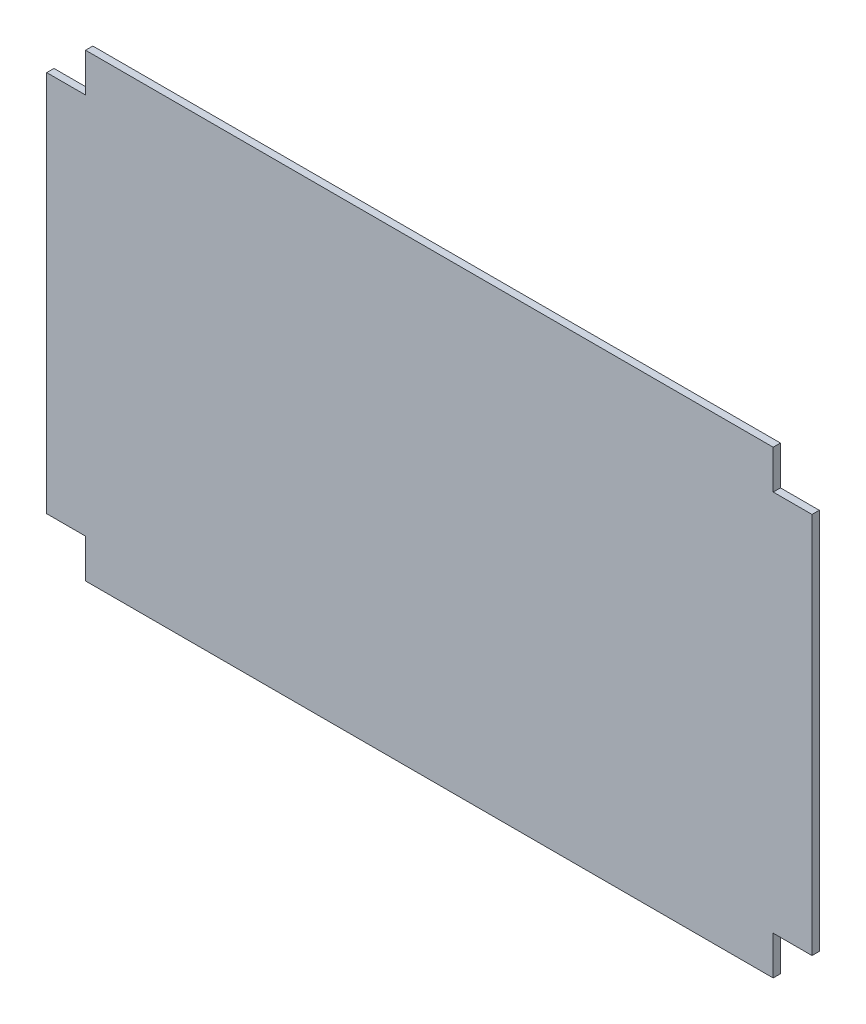
ISO-10303-21;
HEADER;
FILE_DESCRIPTION(('STEP AP214'),'2;1');
FILE_NAME('part.step','',(''),(''),'','','');
FILE_SCHEMA(('AUTOMOTIVE_DESIGN { 1 0 10303 214 1 1 1 1 }'));
ENDSEC;
DATA;
#1=APPLICATION_CONTEXT('core data for automotive mechanical design processes');
#2=APPLICATION_PROTOCOL_DEFINITION('international standard','automotive_design',2000,#1);
#3=PRODUCT_CONTEXT('',#1,'mechanical');
#4=PRODUCT('Part','Part','',(#3));
#5=PRODUCT_RELATED_PRODUCT_CATEGORY('part','',(#4));
#6=PRODUCT_DEFINITION_FORMATION('','',#4);
#7=PRODUCT_DEFINITION_CONTEXT('part definition',#1,'design');
#8=PRODUCT_DEFINITION('design','',#6,#7);
#9=PRODUCT_DEFINITION_SHAPE('','',#8);
#10=(LENGTH_UNIT() NAMED_UNIT(*) SI_UNIT(.MILLI.,.METRE.));
#11=(NAMED_UNIT(*) PLANE_ANGLE_UNIT() SI_UNIT($,.RADIAN.));
#12=(NAMED_UNIT(*) SI_UNIT($,.STERADIAN.) SOLID_ANGLE_UNIT());
#13=UNCERTAINTY_MEASURE_WITH_UNIT(LENGTH_MEASURE(1.E-05),#10,'distance_accuracy_value','');
#14=(GEOMETRIC_REPRESENTATION_CONTEXT(3) GLOBAL_UNCERTAINTY_ASSIGNED_CONTEXT((#13)) GLOBAL_UNIT_ASSIGNED_CONTEXT((#10,
#11,#12)) REPRESENTATION_CONTEXT('',''));
#15=CARTESIAN_POINT('',(0.,0.,0.));
#16=DIRECTION('',(0.,0.,1.));
#17=DIRECTION('',(1.,0.,0.));
#18=AXIS2_PLACEMENT_3D('',#15,#16,#17);
#19=CARTESIAN_POINT('',(-250.4,150.400000000001,4.75));
#20=DIRECTION('',(1.,0.,0.));
#21=DIRECTION('',(0.,1.,0.));
#22=AXIS2_PLACEMENT_3D('',#19,#20,#21);
#23=PLANE('',#22);
#24=DIRECTION('',(0.,-1.,0.));
#25=VECTOR('',#24,1.);
#26=CARTESIAN_POINT('',(-250.4,150.400000000001,4.75));
#27=LINE('',#26,#25);
#28=CARTESIAN_POINT('',(-250.4,125.000000000001,4.75));
#29=VERTEX_POINT('',#28);
#30=CARTESIAN_POINT('',(-250.4,-124.999999999999,4.75));
#31=VERTEX_POINT('',#30);
#32=EDGE_CURVE('E205',#29,#31,#27,.T.);
#33=ORIENTED_EDGE('',*,*,#32,.F.);
#34=DIRECTION('',(0.,0.,-1.));
#35=VECTOR('',#34,1.);
#36=CARTESIAN_POINT('',(-250.4,125.000000000001,10.));
#37=LINE('',#36,#35);
#38=CARTESIAN_POINT('',(-250.4,125.000000000001,0.));
#39=VERTEX_POINT('',#38);
#40=EDGE_CURVE('E161',#29,#39,#37,.T.);
#41=ORIENTED_EDGE('',*,*,#40,.T.);
#42=DIRECTION('',(0.,-1.,0.));
#43=VECTOR('',#42,1.);
#44=CARTESIAN_POINT('',(-250.4,150.400000000001,0.));
#45=LINE('',#44,#43);
#46=CARTESIAN_POINT('',(-250.4,-124.999999999999,0.));
#47=VERTEX_POINT('',#46);
#48=EDGE_CURVE('E204',#39,#47,#45,.T.);
#49=ORIENTED_EDGE('',*,*,#48,.T.);
#50=DIRECTION('',(0.,0.,-1.));
#51=VECTOR('',#50,1.);
#52=CARTESIAN_POINT('',(-250.4,-124.999999999999,10.));
#53=LINE('',#52,#51);
#54=EDGE_CURVE('E138',#31,#47,#53,.T.);
#55=ORIENTED_EDGE('',*,*,#54,.F.);
#56=EDGE_LOOP('',(#33,#41,#49,#55));
#57=FACE_BOUND('',#56,.T.);
#58=ADVANCED_FACE('F36',(#57),#23,.F.);
#59=CARTESIAN_POINT('',(-250.4,-150.399999999999,4.75));
#60=DIRECTION('',(0.,1.,0.));
#61=DIRECTION('',(0.,0.,1.));
#62=AXIS2_PLACEMENT_3D('',#59,#60,#61);
#63=PLANE('',#62);
#64=DIRECTION('',(1.,0.,0.));
#65=VECTOR('',#64,1.);
#66=CARTESIAN_POINT('',(-250.4,-150.399999999999,0.));
#67=LINE('',#66,#65);
#68=CARTESIAN_POINT('',(-225.,-150.399999999999,0.));
#69=VERTEX_POINT('',#68);
#70=CARTESIAN_POINT('',(225.,-150.399999999999,0.));
#71=VERTEX_POINT('',#70);
#72=EDGE_CURVE('E152',#69,#71,#67,.T.);
#73=ORIENTED_EDGE('',*,*,#72,.T.);
#74=DIRECTION('',(0.,0.,-1.));
#75=VECTOR('',#74,1.);
#76=CARTESIAN_POINT('',(225.,-150.399999999999,10.));
#77=LINE('',#76,#75);
#78=CARTESIAN_POINT('',(225.,-150.399999999999,4.75));
#79=VERTEX_POINT('',#78);
#80=EDGE_CURVE('E52',#79,#71,#77,.T.);
#81=ORIENTED_EDGE('',*,*,#80,.F.);
#82=DIRECTION('',(1.,0.,0.));
#83=VECTOR('',#82,1.);
#84=CARTESIAN_POINT('',(-250.4,-150.399999999999,4.75));
#85=LINE('',#84,#83);
#86=CARTESIAN_POINT('',(-225.,-150.399999999999,4.75));
#87=VERTEX_POINT('',#86);
#88=EDGE_CURVE('E208',#87,#79,#85,.T.);
#89=ORIENTED_EDGE('',*,*,#88,.F.);
#90=DIRECTION('',(0.,0.,-1.));
#91=VECTOR('',#90,1.);
#92=CARTESIAN_POINT('',(-225.,-150.399999999999,10.));
#93=LINE('',#92,#91);
#94=EDGE_CURVE('E137',#87,#69,#93,.T.);
#95=ORIENTED_EDGE('',*,*,#94,.T.);
#96=EDGE_LOOP('',(#73,#81,#89,#95));
#97=FACE_BOUND('',#96,.T.);
#98=ADVANCED_FACE('F246',(#97),#63,.F.);
#99=CARTESIAN_POINT('',(250.4,150.400000000001,4.75));
#100=DIRECTION('',(1.,0.,0.));
#101=DIRECTION('',(0.,1.,0.));
#102=AXIS2_PLACEMENT_3D('',#99,#100,#101);
#103=PLANE('',#102);
#104=DIRECTION('',(0.,0.,-1.));
#105=VECTOR('',#104,1.);
#106=CARTESIAN_POINT('',(250.4,-124.999999999999,10.));
#107=LINE('',#106,#105);
#108=CARTESIAN_POINT('',(250.4,-124.999999999999,4.75));
#109=VERTEX_POINT('',#108);
#110=CARTESIAN_POINT('',(250.4,-124.999999999999,0.));
#111=VERTEX_POINT('',#110);
#112=EDGE_CURVE('E163',#109,#111,#107,.T.);
#113=ORIENTED_EDGE('',*,*,#112,.T.);
#114=DIRECTION('',(0.,-1.,0.));
#115=VECTOR('',#114,1.);
#116=CARTESIAN_POINT('',(250.4,150.400000000001,0.));
#117=LINE('',#116,#115);
#118=CARTESIAN_POINT('',(250.4,125.000000000001,0.));
#119=VERTEX_POINT('',#118);
#120=EDGE_CURVE('E214',#119,#111,#117,.T.);
#121=ORIENTED_EDGE('',*,*,#120,.F.);
#122=DIRECTION('',(0.,0.,-1.));
#123=VECTOR('',#122,1.);
#124=CARTESIAN_POINT('',(250.4,125.000000000001,10.));
#125=LINE('',#124,#123);
#126=CARTESIAN_POINT('',(250.4,125.000000000001,4.75));
#127=VERTEX_POINT('',#126);
#128=EDGE_CURVE('E60',#127,#119,#125,.T.);
#129=ORIENTED_EDGE('',*,*,#128,.F.);
#130=DIRECTION('',(0.,-1.,0.));
#131=VECTOR('',#130,1.);
#132=CARTESIAN_POINT('',(250.4,150.400000000001,4.75));
#133=LINE('',#132,#131);
#134=EDGE_CURVE('E44',#127,#109,#133,.T.);
#135=ORIENTED_EDGE('',*,*,#134,.T.);
#136=EDGE_LOOP('',(#113,#121,#129,#135));
#137=FACE_BOUND('',#136,.T.);
#138=ADVANCED_FACE('F238',(#137),#103,.T.);
#139=CARTESIAN_POINT('',(-250.4,150.400000000001,4.75));
#140=DIRECTION('',(0.,1.,0.));
#141=DIRECTION('',(0.,0.,1.));
#142=AXIS2_PLACEMENT_3D('',#139,#140,#141);
#143=PLANE('',#142);
#144=DIRECTION('',(0.,0.,-1.));
#145=VECTOR('',#144,1.);
#146=CARTESIAN_POINT('',(-225.,150.400000000001,10.));
#147=LINE('',#146,#145);
#148=CARTESIAN_POINT('',(-225.,150.400000000001,4.75));
#149=VERTEX_POINT('',#148);
#150=CARTESIAN_POINT('',(-225.,150.400000000001,0.));
#151=VERTEX_POINT('',#150);
#152=EDGE_CURVE('E174',#149,#151,#147,.T.);
#153=ORIENTED_EDGE('',*,*,#152,.F.);
#154=DIRECTION('',(1.,0.,0.));
#155=VECTOR('',#154,1.);
#156=CARTESIAN_POINT('',(-250.4,150.400000000001,4.75));
#157=LINE('',#156,#155);
#158=CARTESIAN_POINT('',(225.,150.400000000001,4.75));
#159=VERTEX_POINT('',#158);
#160=EDGE_CURVE('E11',#149,#159,#157,.T.);
#161=ORIENTED_EDGE('',*,*,#160,.T.);
#162=DIRECTION('',(0.,0.,-1.));
#163=VECTOR('',#162,1.);
#164=CARTESIAN_POINT('',(225.,150.400000000001,10.));
#165=LINE('',#164,#163);
#166=CARTESIAN_POINT('',(225.,150.400000000001,0.));
#167=VERTEX_POINT('',#166);
#168=EDGE_CURVE('E183',#159,#167,#165,.T.);
#169=ORIENTED_EDGE('',*,*,#168,.T.);
#170=DIRECTION('',(1.,0.,0.));
#171=VECTOR('',#170,1.);
#172=CARTESIAN_POINT('',(-250.4,150.400000000001,0.));
#173=LINE('',#172,#171);
#174=EDGE_CURVE('E39',#151,#167,#173,.T.);
#175=ORIENTED_EDGE('',*,*,#174,.F.);
#176=EDGE_LOOP('',(#153,#161,#169,#175));
#177=FACE_BOUND('',#176,.T.);
#178=ADVANCED_FACE('F224',(#177),#143,.T.);
#179=CARTESIAN_POINT('',(0.,0.,4.75));
#180=DIRECTION('',(0.,0.,1.));
#181=DIRECTION('',(1.,0.,0.));
#182=AXIS2_PLACEMENT_3D('',#179,#180,#181);
#183=PLANE('',#182);
#184=DIRECTION('',(-1.,0.,0.));
#185=VECTOR('',#184,1.);
#186=CARTESIAN_POINT('',(0.,-124.999999999999,4.75));
#187=LINE('',#186,#185);
#188=CARTESIAN_POINT('',(225.,-124.999999999999,4.75));
#189=VERTEX_POINT('',#188);
#190=EDGE_CURVE('E202',#109,#189,#187,.T.);
#191=ORIENTED_EDGE('',*,*,#190,.F.);
#192=ORIENTED_EDGE('',*,*,#134,.F.);
#193=DIRECTION('',(1.,0.,0.));
#194=VECTOR('',#193,1.);
#195=CARTESIAN_POINT('',(0.,125.000000000001,4.75));
#196=LINE('',#195,#194);
#197=CARTESIAN_POINT('',(225.,125.000000000001,4.75));
#198=VERTEX_POINT('',#197);
#199=EDGE_CURVE('E186',#198,#127,#196,.T.);
#200=ORIENTED_EDGE('',*,*,#199,.F.);
#201=DIRECTION('',(0.,-1.,0.));
#202=VECTOR('',#201,1.);
#203=CARTESIAN_POINT('',(225.,0.,4.75));
#204=LINE('',#203,#202);
#205=EDGE_CURVE('E191',#159,#198,#204,.T.);
#206=ORIENTED_EDGE('',*,*,#205,.F.);
#207=ORIENTED_EDGE('',*,*,#160,.F.);
#208=DIRECTION('',(0.,1.,0.));
#209=VECTOR('',#208,1.);
#210=CARTESIAN_POINT('',(-225.,0.,4.75));
#211=LINE('',#210,#209);
#212=CARTESIAN_POINT('',(-225.,125.000000000001,4.75));
#213=VERTEX_POINT('',#212);
#214=EDGE_CURVE('E196',#213,#149,#211,.T.);
#215=ORIENTED_EDGE('',*,*,#214,.F.);
#216=DIRECTION('',(1.,0.,0.));
#217=VECTOR('',#216,1.);
#218=CARTESIAN_POINT('',(0.,125.000000000001,4.75));
#219=LINE('',#218,#217);
#220=EDGE_CURVE('E198',#29,#213,#219,.T.);
#221=ORIENTED_EDGE('',*,*,#220,.F.);
#222=ORIENTED_EDGE('',*,*,#32,.T.);
#223=DIRECTION('',(-1.,0.,0.));
#224=VECTOR('',#223,1.);
#225=CARTESIAN_POINT('',(0.,-124.999999999999,4.75));
#226=LINE('',#225,#224);
#227=CARTESIAN_POINT('',(-225.,-124.999999999999,4.75));
#228=VERTEX_POINT('',#227);
#229=EDGE_CURVE('E193',#228,#31,#226,.T.);
#230=ORIENTED_EDGE('',*,*,#229,.F.);
#231=DIRECTION('',(0.,1.,0.));
#232=VECTOR('',#231,1.);
#233=CARTESIAN_POINT('',(-225.000000000001,-1.47519791657871E-12,4.75));
#234=LINE('',#233,#232);
#235=EDGE_CURVE('E134',#87,#228,#234,.T.);
#236=ORIENTED_EDGE('',*,*,#235,.F.);
#237=ORIENTED_EDGE('',*,*,#88,.T.);
#238=DIRECTION('',(0.,-1.,0.));
#239=VECTOR('',#238,1.);
#240=CARTESIAN_POINT('',(225.,0.,4.75));
#241=LINE('',#240,#239);
#242=EDGE_CURVE('E200',#189,#79,#241,.T.);
#243=ORIENTED_EDGE('',*,*,#242,.F.);
#244=EDGE_LOOP('',(#191,#192,#200,#206,#207,#215,#221,#222,#230,#236,#237,#243));
#245=FACE_BOUND('',#244,.T.);
#246=ADVANCED_FACE('F233',(#245),#183,.T.);
#247=CARTESIAN_POINT('',(0.,0.,0.));
#248=DIRECTION('',(0.,0.,1.));
#249=DIRECTION('',(1.,0.,0.));
#250=AXIS2_PLACEMENT_3D('',#247,#248,#249);
#251=PLANE('',#250);
#252=ORIENTED_EDGE('',*,*,#120,.T.);
#253=DIRECTION('',(1.,0.,0.));
#254=VECTOR('',#253,1.);
#255=CARTESIAN_POINT('',(250.4,-124.999999999999,0.));
#256=LINE('',#255,#254);
#257=CARTESIAN_POINT('',(225.,-124.999999999999,0.));
#258=VERTEX_POINT('',#257);
#259=EDGE_CURVE('E160',#258,#111,#256,.T.);
#260=ORIENTED_EDGE('',*,*,#259,.F.);
#261=DIRECTION('',(0.,1.,0.));
#262=VECTOR('',#261,1.);
#263=CARTESIAN_POINT('',(225.,-150.399999999999,0.));
#264=LINE('',#263,#262);
#265=EDGE_CURVE('E158',#71,#258,#264,.T.);
#266=ORIENTED_EDGE('',*,*,#265,.F.);
#267=ORIENTED_EDGE('',*,*,#72,.F.);
#268=DIRECTION('',(0.,-1.,0.));
#269=VECTOR('',#268,1.);
#270=CARTESIAN_POINT('',(-225.,-150.399999999999,0.));
#271=LINE('',#270,#269);
#272=CARTESIAN_POINT('',(-225.,-124.999999999999,0.));
#273=VERTEX_POINT('',#272);
#274=EDGE_CURVE('E131',#273,#69,#271,.T.);
#275=ORIENTED_EDGE('',*,*,#274,.F.);
#276=DIRECTION('',(1.,0.,0.));
#277=VECTOR('',#276,1.);
#278=CARTESIAN_POINT('',(-250.4,-124.999999999999,0.));
#279=LINE('',#278,#277);
#280=EDGE_CURVE('E141',#47,#273,#279,.T.);
#281=ORIENTED_EDGE('',*,*,#280,.F.);
#282=ORIENTED_EDGE('',*,*,#48,.F.);
#283=DIRECTION('',(-1.,0.,0.));
#284=VECTOR('',#283,1.);
#285=CARTESIAN_POINT('',(-250.4,125.000000000001,0.));
#286=LINE('',#285,#284);
#287=CARTESIAN_POINT('',(-225.,125.000000000001,0.));
#288=VERTEX_POINT('',#287);
#289=EDGE_CURVE('E172',#288,#39,#286,.T.);
#290=ORIENTED_EDGE('',*,*,#289,.F.);
#291=DIRECTION('',(0.,-1.,0.));
#292=VECTOR('',#291,1.);
#293=CARTESIAN_POINT('',(-225.,150.400000000001,0.));
#294=LINE('',#293,#292);
#295=EDGE_CURVE('E156',#151,#288,#294,.T.);
#296=ORIENTED_EDGE('',*,*,#295,.F.);
#297=ORIENTED_EDGE('',*,*,#174,.T.);
#298=DIRECTION('',(0.,1.,0.));
#299=VECTOR('',#298,1.);
#300=CARTESIAN_POINT('',(225.,150.400000000001,0.));
#301=LINE('',#300,#299);
#302=CARTESIAN_POINT('',(225.,125.000000000001,0.));
#303=VERTEX_POINT('',#302);
#304=EDGE_CURVE('E181',#303,#167,#301,.T.);
#305=ORIENTED_EDGE('',*,*,#304,.F.);
#306=DIRECTION('',(-1.,0.,0.));
#307=VECTOR('',#306,1.);
#308=CARTESIAN_POINT('',(250.4,125.000000000001,0.));
#309=LINE('',#308,#307);
#310=EDGE_CURVE('E166',#119,#303,#309,.T.);
#311=ORIENTED_EDGE('',*,*,#310,.F.);
#312=EDGE_LOOP('',(#252,#260,#266,#267,#275,#281,#282,#290,#296,#297,#305,#311));
#313=FACE_BOUND('',#312,.T.);
#314=ADVANCED_FACE('F150',(#313),#251,.F.);
#315=CARTESIAN_POINT('',(225.,150.400000000001,10.));
#316=DIRECTION('',(-1.,0.,0.));
#317=DIRECTION('',(0.,0.,1.));
#318=AXIS2_PLACEMENT_3D('',#315,#316,#317);
#319=PLANE('',#318);
#320=ORIENTED_EDGE('',*,*,#205,.T.);
#321=DIRECTION('',(0.,0.,-1.));
#322=VECTOR('',#321,1.);
#323=CARTESIAN_POINT('',(225.,125.000000000001,10.));
#324=LINE('',#323,#322);
#325=EDGE_CURVE('E187',#198,#303,#324,.T.);
#326=ORIENTED_EDGE('',*,*,#325,.T.);
#327=ORIENTED_EDGE('',*,*,#304,.T.);
#328=ORIENTED_EDGE('',*,*,#168,.F.);
#329=EDGE_LOOP('',(#320,#326,#327,#328));
#330=FACE_BOUND('',#329,.T.);
#331=ADVANCED_FACE('F228',(#330),#319,.F.);
#332=CARTESIAN_POINT('',(250.4,125.000000000001,10.));
#333=DIRECTION('',(0.,-1.,0.));
#334=DIRECTION('',(0.,0.,-1.));
#335=AXIS2_PLACEMENT_3D('',#332,#333,#334);
#336=PLANE('',#335);
#337=ORIENTED_EDGE('',*,*,#199,.T.);
#338=ORIENTED_EDGE('',*,*,#128,.T.);
#339=ORIENTED_EDGE('',*,*,#310,.T.);
#340=ORIENTED_EDGE('',*,*,#325,.F.);
#341=EDGE_LOOP('',(#337,#338,#339,#340));
#342=FACE_BOUND('',#341,.T.);
#343=ADVANCED_FACE('F236',(#342),#336,.F.);
#344=CARTESIAN_POINT('',(-225.,-150.399999999999,10.));
#345=DIRECTION('',(1.,0.,0.));
#346=DIRECTION('',(0.,1.,0.));
#347=AXIS2_PLACEMENT_3D('',#344,#345,#346);
#348=PLANE('',#347);
#349=ORIENTED_EDGE('',*,*,#235,.T.);
#350=DIRECTION('',(0.,0.,-1.));
#351=VECTOR('',#350,1.);
#352=CARTESIAN_POINT('',(-225.,-124.999999999999,10.));
#353=LINE('',#352,#351);
#354=EDGE_CURVE('E127',#228,#273,#353,.T.);
#355=ORIENTED_EDGE('',*,*,#354,.T.);
#356=ORIENTED_EDGE('',*,*,#274,.T.);
#357=ORIENTED_EDGE('',*,*,#94,.F.);
#358=EDGE_LOOP('',(#349,#355,#356,#357));
#359=FACE_BOUND('',#358,.T.);
#360=ADVANCED_FACE('F129',(#359),#348,.F.);
#361=CARTESIAN_POINT('',(-250.4,-124.999999999999,10.));
#362=DIRECTION('',(0.,1.,0.));
#363=DIRECTION('',(0.,0.,1.));
#364=AXIS2_PLACEMENT_3D('',#361,#362,#363);
#365=PLANE('',#364);
#366=ORIENTED_EDGE('',*,*,#229,.T.);
#367=ORIENTED_EDGE('',*,*,#54,.T.);
#368=ORIENTED_EDGE('',*,*,#280,.T.);
#369=ORIENTED_EDGE('',*,*,#354,.F.);
#370=EDGE_LOOP('',(#366,#367,#368,#369));
#371=FACE_BOUND('',#370,.T.);
#372=ADVANCED_FACE('F142',(#371),#365,.F.);
#373=CARTESIAN_POINT('',(-250.4,125.000000000001,10.));
#374=DIRECTION('',(0.,-1.,0.));
#375=DIRECTION('',(0.,0.,-1.));
#376=AXIS2_PLACEMENT_3D('',#373,#374,#375);
#377=PLANE('',#376);
#378=ORIENTED_EDGE('',*,*,#220,.T.);
#379=DIRECTION('',(0.,0.,-1.));
#380=VECTOR('',#379,1.);
#381=CARTESIAN_POINT('',(-225.,125.000000000001,10.));
#382=LINE('',#381,#380);
#383=EDGE_CURVE('E177',#213,#288,#382,.T.);
#384=ORIENTED_EDGE('',*,*,#383,.T.);
#385=ORIENTED_EDGE('',*,*,#289,.T.);
#386=ORIENTED_EDGE('',*,*,#40,.F.);
#387=EDGE_LOOP('',(#378,#384,#385,#386));
#388=FACE_BOUND('',#387,.T.);
#389=ADVANCED_FACE('F251',(#388),#377,.F.);
#390=CARTESIAN_POINT('',(-225.,150.400000000001,10.));
#391=DIRECTION('',(1.,0.,0.));
#392=DIRECTION('',(0.,0.,-1.));
#393=AXIS2_PLACEMENT_3D('',#390,#391,#392);
#394=PLANE('',#393);
#395=ORIENTED_EDGE('',*,*,#214,.T.);
#396=ORIENTED_EDGE('',*,*,#152,.T.);
#397=ORIENTED_EDGE('',*,*,#295,.T.);
#398=ORIENTED_EDGE('',*,*,#383,.F.);
#399=EDGE_LOOP('',(#395,#396,#397,#398));
#400=FACE_BOUND('',#399,.T.);
#401=ADVANCED_FACE('F254',(#400),#394,.F.);
#402=CARTESIAN_POINT('',(250.4,-124.999999999999,10.));
#403=DIRECTION('',(0.,1.,0.));
#404=DIRECTION('',(0.,0.,1.));
#405=AXIS2_PLACEMENT_3D('',#402,#403,#404);
#406=PLANE('',#405);
#407=ORIENTED_EDGE('',*,*,#190,.T.);
#408=DIRECTION('',(0.,0.,-1.));
#409=VECTOR('',#408,1.);
#410=CARTESIAN_POINT('',(225.,-124.999999999999,10.));
#411=LINE('',#410,#409);
#412=EDGE_CURVE('E167',#189,#258,#411,.T.);
#413=ORIENTED_EDGE('',*,*,#412,.T.);
#414=ORIENTED_EDGE('',*,*,#259,.T.);
#415=ORIENTED_EDGE('',*,*,#112,.F.);
#416=EDGE_LOOP('',(#407,#413,#414,#415));
#417=FACE_BOUND('',#416,.T.);
#418=ADVANCED_FACE('F240',(#417),#406,.F.);
#419=CARTESIAN_POINT('',(225.,-150.399999999999,10.));
#420=DIRECTION('',(-1.,0.,0.));
#421=DIRECTION('',(0.,0.,1.));
#422=AXIS2_PLACEMENT_3D('',#419,#420,#421);
#423=PLANE('',#422);
#424=ORIENTED_EDGE('',*,*,#242,.T.);
#425=ORIENTED_EDGE('',*,*,#80,.T.);
#426=ORIENTED_EDGE('',*,*,#265,.T.);
#427=ORIENTED_EDGE('',*,*,#412,.F.);
#428=EDGE_LOOP('',(#424,#425,#426,#427));
#429=FACE_BOUND('',#428,.T.);
#430=ADVANCED_FACE('F244',(#429),#423,.F.);
#431=CLOSED_SHELL('',(#58,#98,#138,#178,#246,#314,#331,#343,#360,#372,#389,#401,#418,#430));
#432=MANIFOLD_SOLID_BREP('B2',#431);
#433=ADVANCED_BREP_SHAPE_REPRESENTATION('',(#18,#432),#14);
#434=SHAPE_DEFINITION_REPRESENTATION(#9,#433);
ENDSEC;
END-ISO-10303-21;
